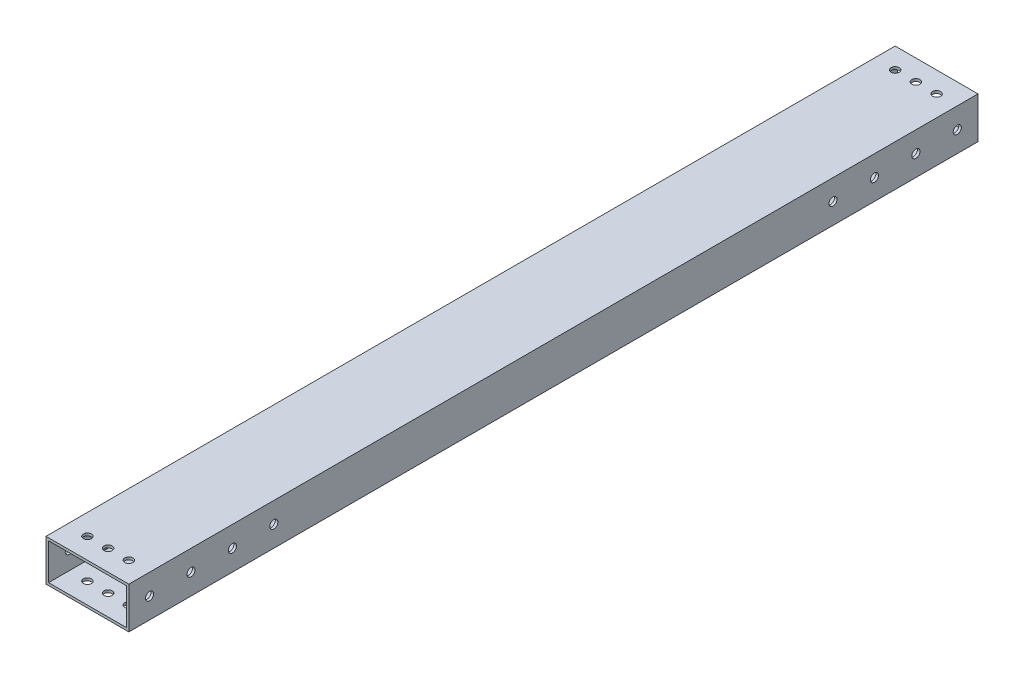
ISO-10303-21;
HEADER;
FILE_DESCRIPTION(('STEP AP214'),'2;1');
FILE_NAME('part.step','',(''),(''),'','','');
FILE_SCHEMA(('AUTOMOTIVE_DESIGN { 1 0 10303 214 1 1 1 1 }'));
ENDSEC;
DATA;
#1=APPLICATION_CONTEXT('core data for automotive mechanical design processes');
#2=APPLICATION_PROTOCOL_DEFINITION('international standard','automotive_design',2000,#1);
#3=PRODUCT_CONTEXT('',#1,'mechanical');
#4=PRODUCT('Part','Part','',(#3));
#5=PRODUCT_RELATED_PRODUCT_CATEGORY('part','',(#4));
#6=PRODUCT_DEFINITION_FORMATION('','',#4);
#7=PRODUCT_DEFINITION_CONTEXT('part definition',#1,'design');
#8=PRODUCT_DEFINITION('design','',#6,#7);
#9=PRODUCT_DEFINITION_SHAPE('','',#8);
#10=(LENGTH_UNIT() NAMED_UNIT(*) SI_UNIT(.MILLI.,.METRE.));
#11=(NAMED_UNIT(*) PLANE_ANGLE_UNIT() SI_UNIT($,.RADIAN.));
#12=(NAMED_UNIT(*) SI_UNIT($,.STERADIAN.) SOLID_ANGLE_UNIT());
#13=UNCERTAINTY_MEASURE_WITH_UNIT(LENGTH_MEASURE(1.E-05),#10,'distance_accuracy_value','');
#14=(GEOMETRIC_REPRESENTATION_CONTEXT(3) GLOBAL_UNCERTAINTY_ASSIGNED_CONTEXT((#13)) GLOBAL_UNIT_ASSIGNED_CONTEXT((#10,
#11,#12)) REPRESENTATION_CONTEXT('',''));
#15=CARTESIAN_POINT('',(0.,0.,0.));
#16=DIRECTION('',(0.,0.,1.));
#17=DIRECTION('',(1.,0.,0.));
#18=AXIS2_PLACEMENT_3D('',#15,#16,#17);
#19=CARTESIAN_POINT('',(0.,0.,260.35));
#20=DIRECTION('',(0.,0.,-1.));
#21=DIRECTION('',(-1.,0.,0.));
#22=AXIS2_PLACEMENT_3D('',#19,#20,#21);
#23=PLANE('',#22);
#24=DIRECTION('',(0.,1.,0.));
#25=VECTOR('',#24,1.);
#26=CARTESIAN_POINT('',(25.4,-12.7,260.35));
#27=LINE('',#26,#25);
#28=CARTESIAN_POINT('',(25.4,-12.7,260.35));
#29=VERTEX_POINT('',#28);
#30=CARTESIAN_POINT('',(25.4,12.7,260.35));
#31=VERTEX_POINT('',#30);
#32=EDGE_CURVE('E163',#29,#31,#27,.T.);
#33=ORIENTED_EDGE('',*,*,#32,.T.);
#34=DIRECTION('',(-1.,0.,0.));
#35=VECTOR('',#34,1.);
#36=CARTESIAN_POINT('',(-25.4,12.7,260.35));
#37=LINE('',#36,#35);
#38=CARTESIAN_POINT('',(-25.4,12.7,260.35));
#39=VERTEX_POINT('',#38);
#40=EDGE_CURVE('E167',#31,#39,#37,.T.);
#41=ORIENTED_EDGE('',*,*,#40,.T.);
#42=DIRECTION('',(0.,-1.,0.));
#43=VECTOR('',#42,1.);
#44=CARTESIAN_POINT('',(-25.4,-12.7,260.35));
#45=LINE('',#44,#43);
#46=CARTESIAN_POINT('',(-25.4,-12.7,260.35));
#47=VERTEX_POINT('',#46);
#48=EDGE_CURVE('E171',#39,#47,#45,.T.);
#49=ORIENTED_EDGE('',*,*,#48,.T.);
#50=DIRECTION('',(1.,0.,0.));
#51=VECTOR('',#50,1.);
#52=CARTESIAN_POINT('',(-25.4,-12.7,260.35));
#53=LINE('',#52,#51);
#54=EDGE_CURVE('E174',#47,#29,#53,.T.);
#55=ORIENTED_EDGE('',*,*,#54,.T.);
#56=EDGE_LOOP('',(#33,#41,#49,#55));
#57=FACE_BOUND('',#56,.T.);
#58=DIRECTION('',(0.,-1.,0.));
#59=VECTOR('',#58,1.);
#60=CARTESIAN_POINT('',(-23.8125,-11.1125,260.35));
#61=LINE('',#60,#59);
#62=CARTESIAN_POINT('',(-23.8125,11.1125,260.35));
#63=VERTEX_POINT('',#62);
#64=CARTESIAN_POINT('',(-23.8125,-11.1125,260.35));
#65=VERTEX_POINT('',#64);
#66=EDGE_CURVE('E113',#63,#65,#61,.T.);
#67=ORIENTED_EDGE('',*,*,#66,.F.);
#68=DIRECTION('',(-1.,0.,0.));
#69=VECTOR('',#68,1.);
#70=CARTESIAN_POINT('',(-23.8125,11.1125,260.35));
#71=LINE('',#70,#69);
#72=CARTESIAN_POINT('',(23.8125,11.1125,260.35));
#73=VERTEX_POINT('',#72);
#74=EDGE_CURVE('E139',#73,#63,#71,.T.);
#75=ORIENTED_EDGE('',*,*,#74,.F.);
#76=DIRECTION('',(0.,1.,0.));
#77=VECTOR('',#76,1.);
#78=CARTESIAN_POINT('',(23.8125,-11.1125,260.35));
#79=LINE('',#78,#77);
#80=CARTESIAN_POINT('',(23.8125,-11.1125,260.35));
#81=VERTEX_POINT('',#80);
#82=EDGE_CURVE('E135',#81,#73,#79,.T.);
#83=ORIENTED_EDGE('',*,*,#82,.F.);
#84=DIRECTION('',(1.,0.,0.));
#85=VECTOR('',#84,1.);
#86=CARTESIAN_POINT('',(-23.8125,-11.1125,260.35));
#87=LINE('',#86,#85);
#88=EDGE_CURVE('E122',#65,#81,#87,.T.);
#89=ORIENTED_EDGE('',*,*,#88,.F.);
#90=EDGE_LOOP('',(#67,#75,#83,#89));
#91=FACE_BOUND('',#90,.T.);
#92=ADVANCED_FACE('F45',(#57,#91),#23,.F.);
#93=CARTESIAN_POINT('',(0.,0.,-260.35));
#94=DIRECTION('',(0.,0.,-1.));
#95=DIRECTION('',(-1.,0.,0.));
#96=AXIS2_PLACEMENT_3D('',#93,#94,#95);
#97=PLANE('',#96);
#98=DIRECTION('',(0.,1.,0.));
#99=VECTOR('',#98,1.);
#100=CARTESIAN_POINT('',(25.4,-12.7,-260.35));
#101=LINE('',#100,#99);
#102=CARTESIAN_POINT('',(25.4,-12.7,-260.35));
#103=VERTEX_POINT('',#102);
#104=CARTESIAN_POINT('',(25.4,12.7,-260.35));
#105=VERTEX_POINT('',#104);
#106=EDGE_CURVE('E131',#103,#105,#101,.T.);
#107=ORIENTED_EDGE('',*,*,#106,.F.);
#108=DIRECTION('',(1.,0.,0.));
#109=VECTOR('',#108,1.);
#110=CARTESIAN_POINT('',(-25.4,-12.7,-260.35));
#111=LINE('',#110,#109);
#112=CARTESIAN_POINT('',(-25.4,-12.7,-260.35));
#113=VERTEX_POINT('',#112);
#114=EDGE_CURVE('E168',#113,#103,#111,.T.);
#115=ORIENTED_EDGE('',*,*,#114,.F.);
#116=DIRECTION('',(0.,-1.,0.));
#117=VECTOR('',#116,1.);
#118=CARTESIAN_POINT('',(-25.4,-12.7,-260.35));
#119=LINE('',#118,#117);
#120=CARTESIAN_POINT('',(-25.4,12.7,-260.35));
#121=VERTEX_POINT('',#120);
#122=EDGE_CURVE('E184',#121,#113,#119,.T.);
#123=ORIENTED_EDGE('',*,*,#122,.F.);
#124=DIRECTION('',(-1.,0.,0.));
#125=VECTOR('',#124,1.);
#126=CARTESIAN_POINT('',(-25.4,12.7,-260.35));
#127=LINE('',#126,#125);
#128=EDGE_CURVE('E181',#105,#121,#127,.T.);
#129=ORIENTED_EDGE('',*,*,#128,.F.);
#130=EDGE_LOOP('',(#107,#115,#123,#129));
#131=FACE_BOUND('',#130,.T.);
#132=DIRECTION('',(-1.,0.,0.));
#133=VECTOR('',#132,1.);
#134=CARTESIAN_POINT('',(-23.8125,11.1125,-260.35));
#135=LINE('',#134,#133);
#136=CARTESIAN_POINT('',(23.8125,11.1125,-260.35));
#137=VERTEX_POINT('',#136);
#138=CARTESIAN_POINT('',(-23.8125,11.1125,-260.35));
#139=VERTEX_POINT('',#138);
#140=EDGE_CURVE('E123',#137,#139,#135,.T.);
#141=ORIENTED_EDGE('',*,*,#140,.T.);
#142=DIRECTION('',(0.,-1.,0.));
#143=VECTOR('',#142,1.);
#144=CARTESIAN_POINT('',(-23.8125,-11.1125,-260.35));
#145=LINE('',#144,#143);
#146=CARTESIAN_POINT('',(-23.8125,-11.1125,-260.35));
#147=VERTEX_POINT('',#146);
#148=EDGE_CURVE('E71',#139,#147,#145,.T.);
#149=ORIENTED_EDGE('',*,*,#148,.T.);
#150=DIRECTION('',(1.,0.,0.));
#151=VECTOR('',#150,1.);
#152=CARTESIAN_POINT('',(-23.8125,-11.1125,-260.35));
#153=LINE('',#152,#151);
#154=CARTESIAN_POINT('',(23.8125,-11.1125,-260.35));
#155=VERTEX_POINT('',#154);
#156=EDGE_CURVE('E129',#147,#155,#153,.T.);
#157=ORIENTED_EDGE('',*,*,#156,.T.);
#158=DIRECTION('',(0.,1.,0.));
#159=VECTOR('',#158,1.);
#160=CARTESIAN_POINT('',(23.8125,-11.1125,-260.35));
#161=LINE('',#160,#159);
#162=EDGE_CURVE('E150',#155,#137,#161,.T.);
#163=ORIENTED_EDGE('',*,*,#162,.T.);
#164=EDGE_LOOP('',(#141,#149,#157,#163));
#165=FACE_BOUND('',#164,.T.);
#166=ADVANCED_FACE('F387',(#131,#165),#97,.T.);
#167=CARTESIAN_POINT('',(25.4,-12.7,260.35));
#168=DIRECTION('',(-1.,0.,0.));
#169=DIRECTION('',(0.,0.,1.));
#170=AXIS2_PLACEMENT_3D('',#167,#168,#169);
#171=PLANE('',#170);
#172=CARTESIAN_POINT('',(25.4,1.76247905159244E-12,-247.65));
#173=DIRECTION('',(1.,0.,0.));
#174=DIRECTION('',(0.,0.,-1.));
#175=AXIS2_PLACEMENT_3D('',#172,#173,#174);
#176=CIRCLE('',#175,2.48920000000001);
#177=CARTESIAN_POINT('',(25.4,1.76247905159244E-12,-250.1392));
#178=VERTEX_POINT('',#177);
#179=EDGE_CURVE('E500',#178,#178,#176,.T.);
#180=ORIENTED_EDGE('',*,*,#179,.F.);
#181=EDGE_LOOP('',(#180));
#182=FACE_BOUND('',#181,.T.);
#183=CARTESIAN_POINT('',(25.4,1.5306762493571E-12,222.25));
#184=DIRECTION('',(1.,0.,0.));
#185=DIRECTION('',(0.,0.,1.));
#186=AXIS2_PLACEMENT_3D('',#183,#184,#185);
#187=CIRCLE('',#186,2.4892);
#188=CARTESIAN_POINT('',(25.4,1.5306762493571E-12,224.7392));
#189=VERTEX_POINT('',#188);
#190=EDGE_CURVE('E524',#189,#189,#187,.T.);
#191=ORIENTED_EDGE('',*,*,#190,.F.);
#192=EDGE_LOOP('',(#191));
#193=FACE_BOUND('',#192,.T.);
#194=CARTESIAN_POINT('',(25.4,1.35953020308354E-12,196.85));
#195=DIRECTION('',(1.,0.,0.));
#196=DIRECTION('',(0.,0.,1.));
#197=AXIS2_PLACEMENT_3D('',#194,#195,#196);
#198=CIRCLE('',#197,2.4892);
#199=CARTESIAN_POINT('',(25.4,1.35953020308354E-12,199.3392));
#200=VERTEX_POINT('',#199);
#201=EDGE_CURVE('E516',#200,#200,#198,.T.);
#202=ORIENTED_EDGE('',*,*,#201,.F.);
#203=EDGE_LOOP('',(#202));
#204=FACE_BOUND('',#203,.T.);
#205=CARTESIAN_POINT('',(25.4,1.18838415680998E-12,171.45));
#206=DIRECTION('',(1.,0.,0.));
#207=DIRECTION('',(0.,0.,1.));
#208=AXIS2_PLACEMENT_3D('',#205,#206,#207);
#209=CIRCLE('',#208,2.4892);
#210=CARTESIAN_POINT('',(25.4,1.18838415680998E-12,173.9392));
#211=VERTEX_POINT('',#210);
#212=EDGE_CURVE('E507',#211,#211,#209,.T.);
#213=ORIENTED_EDGE('',*,*,#212,.F.);
#214=EDGE_LOOP('',(#213));
#215=FACE_BOUND('',#214,.T.);
#216=CARTESIAN_POINT('',(25.4,1.70182229563067E-12,247.65));
#217=DIRECTION('',(1.,0.,0.));
#218=DIRECTION('',(0.,0.,1.));
#219=AXIS2_PLACEMENT_3D('',#216,#217,#218);
#220=CIRCLE('',#219,2.4892);
#221=CARTESIAN_POINT('',(25.4,1.70182229563067E-12,250.1392));
#222=VERTEX_POINT('',#221);
#223=EDGE_CURVE('E504',#222,#222,#220,.T.);
#224=ORIENTED_EDGE('',*,*,#223,.F.);
#225=EDGE_LOOP('',(#224));
#226=FACE_BOUND('',#225,.T.);
#227=CARTESIAN_POINT('',(25.4,1.5851117995792E-12,-222.25));
#228=DIRECTION('',(1.,0.,0.));
#229=DIRECTION('',(0.,0.,-1.));
#230=AXIS2_PLACEMENT_3D('',#227,#228,#229);
#231=CIRCLE('',#230,2.4892);
#232=CARTESIAN_POINT('',(25.4,1.5851117995792E-12,-224.7392));
#233=VERTEX_POINT('',#232);
#234=EDGE_CURVE('E555',#233,#233,#231,.T.);
#235=ORIENTED_EDGE('',*,*,#234,.F.);
#236=EDGE_LOOP('',(#235));
#237=FACE_BOUND('',#236,.T.);
#238=CARTESIAN_POINT('',(25.4,1.40774454756597E-12,-196.85));
#239=DIRECTION('',(1.,0.,0.));
#240=DIRECTION('',(0.,0.,-1.));
#241=AXIS2_PLACEMENT_3D('',#238,#239,#240);
#242=CIRCLE('',#241,2.4892);
#243=CARTESIAN_POINT('',(25.4,1.40774454756597E-12,-199.3392));
#244=VERTEX_POINT('',#243);
#245=EDGE_CURVE('E532',#244,#244,#242,.T.);
#246=ORIENTED_EDGE('',*,*,#245,.F.);
#247=EDGE_LOOP('',(#246));
#248=FACE_BOUND('',#247,.T.);
#249=CARTESIAN_POINT('',(25.4,1.23037729555274E-12,-171.45));
#250=DIRECTION('',(1.,0.,0.));
#251=DIRECTION('',(0.,0.,-1.));
#252=AXIS2_PLACEMENT_3D('',#249,#250,#251);
#253=CIRCLE('',#252,2.4892);
#254=CARTESIAN_POINT('',(25.4,1.23037729555274E-12,-173.9392));
#255=VERTEX_POINT('',#254);
#256=EDGE_CURVE('E541',#255,#255,#253,.T.);
#257=ORIENTED_EDGE('',*,*,#256,.F.);
#258=EDGE_LOOP('',(#257));
#259=FACE_BOUND('',#258,.T.);
#260=ORIENTED_EDGE('',*,*,#106,.T.);
#261=DIRECTION('',(0.,0.,-1.));
#262=VECTOR('',#261,1.);
#263=CARTESIAN_POINT('',(25.4,12.7,260.35));
#264=LINE('',#263,#262);
#265=EDGE_CURVE('E11',#31,#105,#264,.T.);
#266=ORIENTED_EDGE('',*,*,#265,.F.);
#267=ORIENTED_EDGE('',*,*,#32,.F.);
#268=DIRECTION('',(0.,0.,-1.));
#269=VECTOR('',#268,1.);
#270=CARTESIAN_POINT('',(25.4,-12.7,260.35));
#271=LINE('',#270,#269);
#272=EDGE_CURVE('E177',#29,#103,#271,.T.);
#273=ORIENTED_EDGE('',*,*,#272,.T.);
#274=EDGE_LOOP('',(#260,#266,#267,#273));
#275=FACE_BOUND('',#274,.T.);
#276=ADVANCED_FACE('F47',(#182,#193,#204,#215,#226,#237,#248,#259,#275),#171,.F.);
#277=CARTESIAN_POINT('',(-25.4,12.7,260.35));
#278=DIRECTION('',(0.,-1.,0.));
#279=DIRECTION('',(0.,0.,-1.));
#280=AXIS2_PLACEMENT_3D('',#277,#278,#279);
#281=PLANE('',#280);
#282=CARTESIAN_POINT('',(-12.7,12.7,247.65));
#283=DIRECTION('',(0.,1.,0.));
#284=DIRECTION('',(0.,0.,-1.));
#285=AXIS2_PLACEMENT_3D('',#282,#283,#284);
#286=CIRCLE('',#285,2.48920000000002);
#287=CARTESIAN_POINT('',(-12.7,12.7,245.1608));
#288=VERTEX_POINT('',#287);
#289=EDGE_CURVE('E314',#288,#288,#286,.T.);
#290=ORIENTED_EDGE('',*,*,#289,.F.);
#291=EDGE_LOOP('',(#290));
#292=FACE_BOUND('',#291,.T.);
#293=CARTESIAN_POINT('',(0.,12.7,247.65));
#294=DIRECTION('',(0.,1.,0.));
#295=DIRECTION('',(0.,0.,-1.));
#296=AXIS2_PLACEMENT_3D('',#293,#294,#295);
#297=CIRCLE('',#296,2.48920000000002);
#298=CARTESIAN_POINT('',(0.,12.7,245.1608));
#299=VERTEX_POINT('',#298);
#300=EDGE_CURVE('E306',#299,#299,#297,.T.);
#301=ORIENTED_EDGE('',*,*,#300,.F.);
#302=EDGE_LOOP('',(#301));
#303=FACE_BOUND('',#302,.T.);
#304=CARTESIAN_POINT('',(12.7,12.7,247.65));
#305=DIRECTION('',(0.,1.,0.));
#306=DIRECTION('',(0.,0.,-1.));
#307=AXIS2_PLACEMENT_3D('',#304,#305,#306);
#308=CIRCLE('',#307,2.48920000000002);
#309=CARTESIAN_POINT('',(12.7,12.7,245.1608));
#310=VERTEX_POINT('',#309);
#311=EDGE_CURVE('E298',#310,#310,#308,.T.);
#312=ORIENTED_EDGE('',*,*,#311,.F.);
#313=EDGE_LOOP('',(#312));
#314=FACE_BOUND('',#313,.T.);
#315=CARTESIAN_POINT('',(12.7,12.7,-247.65));
#316=DIRECTION('',(0.,1.,0.));
#317=DIRECTION('',(0.,0.,1.));
#318=AXIS2_PLACEMENT_3D('',#315,#316,#317);
#319=CIRCLE('',#318,2.48920000000002);
#320=CARTESIAN_POINT('',(12.7,12.7,-245.1608));
#321=VERTEX_POINT('',#320);
#322=EDGE_CURVE('E290',#321,#321,#319,.T.);
#323=ORIENTED_EDGE('',*,*,#322,.F.);
#324=EDGE_LOOP('',(#323));
#325=FACE_BOUND('',#324,.T.);
#326=CARTESIAN_POINT('',(0.,12.7,-247.65));
#327=DIRECTION('',(0.,1.,0.));
#328=DIRECTION('',(0.,0.,1.));
#329=AXIS2_PLACEMENT_3D('',#326,#327,#328);
#330=CIRCLE('',#329,2.48920000000002);
#331=CARTESIAN_POINT('',(0.,12.7,-245.1608));
#332=VERTEX_POINT('',#331);
#333=EDGE_CURVE('E281',#332,#332,#330,.T.);
#334=ORIENTED_EDGE('',*,*,#333,.F.);
#335=EDGE_LOOP('',(#334));
#336=FACE_BOUND('',#335,.T.);
#337=CARTESIAN_POINT('',(-12.7,12.7,-247.65));
#338=DIRECTION('',(0.,1.,0.));
#339=DIRECTION('',(0.,0.,1.));
#340=AXIS2_PLACEMENT_3D('',#337,#338,#339);
#341=CIRCLE('',#340,2.48920000000002);
#342=CARTESIAN_POINT('',(-12.7,12.7,-245.1608));
#343=VERTEX_POINT('',#342);
#344=EDGE_CURVE('E285',#343,#343,#341,.T.);
#345=ORIENTED_EDGE('',*,*,#344,.F.);
#346=EDGE_LOOP('',(#345));
#347=FACE_BOUND('',#346,.T.);
#348=ORIENTED_EDGE('',*,*,#128,.T.);
#349=DIRECTION('',(0.,0.,-1.));
#350=VECTOR('',#349,1.);
#351=CARTESIAN_POINT('',(-25.4,12.7,260.35));
#352=LINE('',#351,#350);
#353=EDGE_CURVE('E55',#39,#121,#352,.T.);
#354=ORIENTED_EDGE('',*,*,#353,.F.);
#355=ORIENTED_EDGE('',*,*,#40,.F.);
#356=ORIENTED_EDGE('',*,*,#265,.T.);
#357=EDGE_LOOP('',(#348,#354,#355,#356));
#358=FACE_BOUND('',#357,.T.);
#359=ADVANCED_FACE('F391',(#292,#303,#314,#325,#336,#347,#358),#281,.F.);
#360=CARTESIAN_POINT('',(-25.4,-12.7,260.35));
#361=DIRECTION('',(1.,0.,0.));
#362=DIRECTION('',(0.,0.,-1.));
#363=AXIS2_PLACEMENT_3D('',#360,#361,#362);
#364=PLANE('',#363);
#365=CARTESIAN_POINT('',(-25.4,1.76247905159244E-12,-247.65));
#366=DIRECTION('',(1.,0.,0.));
#367=DIRECTION('',(0.,0.,-1.));
#368=AXIS2_PLACEMENT_3D('',#365,#366,#367);
#369=CIRCLE('',#368,2.48920000000001);
#370=CARTESIAN_POINT('',(-25.4,1.76247905159244E-12,-250.1392));
#371=VERTEX_POINT('',#370);
#372=EDGE_CURVE('E234',#371,#371,#369,.T.);
#373=ORIENTED_EDGE('',*,*,#372,.T.);
#374=EDGE_LOOP('',(#373));
#375=FACE_BOUND('',#374,.T.);
#376=CARTESIAN_POINT('',(-25.4,1.5306762493571E-12,222.25));
#377=DIRECTION('',(1.,0.,0.));
#378=DIRECTION('',(0.,0.,1.));
#379=AXIS2_PLACEMENT_3D('',#376,#377,#378);
#380=CIRCLE('',#379,2.4892);
#381=CARTESIAN_POINT('',(-25.4,1.5306762493571E-12,224.7392));
#382=VERTEX_POINT('',#381);
#383=EDGE_CURVE('E528',#382,#382,#380,.T.);
#384=ORIENTED_EDGE('',*,*,#383,.T.);
#385=EDGE_LOOP('',(#384));
#386=FACE_BOUND('',#385,.T.);
#387=CARTESIAN_POINT('',(-25.4,1.35953020308354E-12,196.85));
#388=DIRECTION('',(1.,0.,0.));
#389=DIRECTION('',(0.,0.,1.));
#390=AXIS2_PLACEMENT_3D('',#387,#388,#389);
#391=CIRCLE('',#390,2.4892);
#392=CARTESIAN_POINT('',(-25.4,1.35953020308354E-12,199.3392));
#393=VERTEX_POINT('',#392);
#394=EDGE_CURVE('E520',#393,#393,#391,.T.);
#395=ORIENTED_EDGE('',*,*,#394,.T.);
#396=EDGE_LOOP('',(#395));
#397=FACE_BOUND('',#396,.T.);
#398=CARTESIAN_POINT('',(-25.4,1.18838415680998E-12,171.45));
#399=DIRECTION('',(1.,0.,0.));
#400=DIRECTION('',(0.,0.,1.));
#401=AXIS2_PLACEMENT_3D('',#398,#399,#400);
#402=CIRCLE('',#401,2.4892);
#403=CARTESIAN_POINT('',(-25.4,1.18838415680998E-12,173.9392));
#404=VERTEX_POINT('',#403);
#405=EDGE_CURVE('E512',#404,#404,#402,.T.);
#406=ORIENTED_EDGE('',*,*,#405,.T.);
#407=EDGE_LOOP('',(#406));
#408=FACE_BOUND('',#407,.T.);
#409=CARTESIAN_POINT('',(-25.4,1.70182229563067E-12,247.65));
#410=DIRECTION('',(1.,0.,0.));
#411=DIRECTION('',(0.,0.,1.));
#412=AXIS2_PLACEMENT_3D('',#409,#410,#411);
#413=CIRCLE('',#412,2.4892);
#414=CARTESIAN_POINT('',(-25.4,1.70182229563067E-12,250.1392));
#415=VERTEX_POINT('',#414);
#416=EDGE_CURVE('E551',#415,#415,#413,.T.);
#417=ORIENTED_EDGE('',*,*,#416,.T.);
#418=EDGE_LOOP('',(#417));
#419=FACE_BOUND('',#418,.T.);
#420=CARTESIAN_POINT('',(-25.4,1.5851117995792E-12,-222.25));
#421=DIRECTION('',(1.,0.,0.));
#422=DIRECTION('',(0.,0.,-1.));
#423=AXIS2_PLACEMENT_3D('',#420,#421,#422);
#424=CIRCLE('',#423,2.4892);
#425=CARTESIAN_POINT('',(-25.4,1.5851117995792E-12,-224.7392));
#426=VERTEX_POINT('',#425);
#427=EDGE_CURVE('E536',#426,#426,#424,.T.);
#428=ORIENTED_EDGE('',*,*,#427,.T.);
#429=EDGE_LOOP('',(#428));
#430=FACE_BOUND('',#429,.T.);
#431=CARTESIAN_POINT('',(-25.4,1.40774454756597E-12,-196.85));
#432=DIRECTION('',(1.,0.,0.));
#433=DIRECTION('',(0.,0.,-1.));
#434=AXIS2_PLACEMENT_3D('',#431,#432,#433);
#435=CIRCLE('',#434,2.4892);
#436=CARTESIAN_POINT('',(-25.4,1.40774454756597E-12,-199.3392));
#437=VERTEX_POINT('',#436);
#438=EDGE_CURVE('E537',#437,#437,#435,.T.);
#439=ORIENTED_EDGE('',*,*,#438,.T.);
#440=EDGE_LOOP('',(#439));
#441=FACE_BOUND('',#440,.T.);
#442=CARTESIAN_POINT('',(-25.4,1.23037729555274E-12,-171.45));
#443=DIRECTION('',(1.,0.,0.));
#444=DIRECTION('',(0.,0.,-1.));
#445=AXIS2_PLACEMENT_3D('',#442,#443,#444);
#446=CIRCLE('',#445,2.4892);
#447=CARTESIAN_POINT('',(-25.4,1.23037729555274E-12,-173.9392));
#448=VERTEX_POINT('',#447);
#449=EDGE_CURVE('E511',#448,#448,#446,.T.);
#450=ORIENTED_EDGE('',*,*,#449,.T.);
#451=EDGE_LOOP('',(#450));
#452=FACE_BOUND('',#451,.T.);
#453=ORIENTED_EDGE('',*,*,#122,.T.);
#454=DIRECTION('',(0.,0.,-1.));
#455=VECTOR('',#454,1.);
#456=CARTESIAN_POINT('',(-25.4,-12.7,260.35));
#457=LINE('',#456,#455);
#458=EDGE_CURVE('E192',#47,#113,#457,.T.);
#459=ORIENTED_EDGE('',*,*,#458,.F.);
#460=ORIENTED_EDGE('',*,*,#48,.F.);
#461=ORIENTED_EDGE('',*,*,#353,.T.);
#462=EDGE_LOOP('',(#453,#459,#460,#461));
#463=FACE_BOUND('',#462,.T.);
#464=ADVANCED_FACE('F374',(#375,#386,#397,#408,#419,#430,#441,#452,#463),#364,.F.);
#465=CARTESIAN_POINT('',(-25.4,-12.7,260.35));
#466=DIRECTION('',(0.,1.,0.));
#467=DIRECTION('',(0.,0.,1.));
#468=AXIS2_PLACEMENT_3D('',#465,#466,#467);
#469=PLANE('',#468);
#470=CARTESIAN_POINT('',(-12.7,-12.7,247.65));
#471=DIRECTION('',(0.,1.,0.));
#472=DIRECTION('',(0.,0.,-1.));
#473=AXIS2_PLACEMENT_3D('',#470,#471,#472);
#474=CIRCLE('',#473,2.48920000000002);
#475=CARTESIAN_POINT('',(-12.7,-12.7,245.1608));
#476=VERTEX_POINT('',#475);
#477=EDGE_CURVE('E280',#476,#476,#474,.T.);
#478=ORIENTED_EDGE('',*,*,#477,.T.);
#479=EDGE_LOOP('',(#478));
#480=FACE_BOUND('',#479,.T.);
#481=CARTESIAN_POINT('',(0.,-12.7,247.65));
#482=DIRECTION('',(0.,1.,0.));
#483=DIRECTION('',(0.,0.,-1.));
#484=AXIS2_PLACEMENT_3D('',#481,#482,#483);
#485=CIRCLE('',#484,2.48920000000002);
#486=CARTESIAN_POINT('',(0.,-12.7,245.1608));
#487=VERTEX_POINT('',#486);
#488=EDGE_CURVE('E310',#487,#487,#485,.T.);
#489=ORIENTED_EDGE('',*,*,#488,.T.);
#490=EDGE_LOOP('',(#489));
#491=FACE_BOUND('',#490,.T.);
#492=CARTESIAN_POINT('',(12.7,-12.7,247.65));
#493=DIRECTION('',(0.,1.,0.));
#494=DIRECTION('',(0.,0.,-1.));
#495=AXIS2_PLACEMENT_3D('',#492,#493,#494);
#496=CIRCLE('',#495,2.48920000000002);
#497=CARTESIAN_POINT('',(12.7,-12.7,245.1608));
#498=VERTEX_POINT('',#497);
#499=EDGE_CURVE('E302',#498,#498,#496,.T.);
#500=ORIENTED_EDGE('',*,*,#499,.T.);
#501=EDGE_LOOP('',(#500));
#502=FACE_BOUND('',#501,.T.);
#503=CARTESIAN_POINT('',(12.7,-12.7,-247.65));
#504=DIRECTION('',(0.,1.,0.));
#505=DIRECTION('',(0.,0.,1.));
#506=AXIS2_PLACEMENT_3D('',#503,#504,#505);
#507=CIRCLE('',#506,2.48920000000002);
#508=CARTESIAN_POINT('',(12.7,-12.7,-245.1608));
#509=VERTEX_POINT('',#508);
#510=EDGE_CURVE('E294',#509,#509,#507,.T.);
#511=ORIENTED_EDGE('',*,*,#510,.T.);
#512=EDGE_LOOP('',(#511));
#513=FACE_BOUND('',#512,.T.);
#514=CARTESIAN_POINT('',(0.,-12.7,-247.65));
#515=DIRECTION('',(0.,1.,0.));
#516=DIRECTION('',(0.,0.,1.));
#517=AXIS2_PLACEMENT_3D('',#514,#515,#516);
#518=CIRCLE('',#517,2.48920000000002);
#519=CARTESIAN_POINT('',(0.,-12.7,-245.1608));
#520=VERTEX_POINT('',#519);
#521=EDGE_CURVE('E286',#520,#520,#518,.T.);
#522=ORIENTED_EDGE('',*,*,#521,.T.);
#523=EDGE_LOOP('',(#522));
#524=FACE_BOUND('',#523,.T.);
#525=CARTESIAN_POINT('',(-12.7,-12.7,-247.65));
#526=DIRECTION('',(0.,1.,0.));
#527=DIRECTION('',(0.,0.,1.));
#528=AXIS2_PLACEMENT_3D('',#525,#526,#527);
#529=CIRCLE('',#528,2.48920000000002);
#530=CARTESIAN_POINT('',(-12.7,-12.7,-245.1608));
#531=VERTEX_POINT('',#530);
#532=EDGE_CURVE('E204',#531,#531,#529,.T.);
#533=ORIENTED_EDGE('',*,*,#532,.T.);
#534=EDGE_LOOP('',(#533));
#535=FACE_BOUND('',#534,.T.);
#536=ORIENTED_EDGE('',*,*,#114,.T.);
#537=ORIENTED_EDGE('',*,*,#272,.F.);
#538=ORIENTED_EDGE('',*,*,#54,.F.);
#539=ORIENTED_EDGE('',*,*,#458,.T.);
#540=EDGE_LOOP('',(#536,#537,#538,#539));
#541=FACE_BOUND('',#540,.T.);
#542=ADVANCED_FACE('F371',(#480,#491,#502,#513,#524,#535,#541),#469,.F.);
#543=CARTESIAN_POINT('',(-23.8125,-11.1125,260.35));
#544=DIRECTION('',(1.,0.,0.));
#545=DIRECTION('',(0.,0.,-1.));
#546=AXIS2_PLACEMENT_3D('',#543,#544,#545);
#547=PLANE('',#546);
#548=CARTESIAN_POINT('',(-23.8125,1.76247905159244E-12,-247.65));
#549=DIRECTION('',(1.,0.,0.));
#550=DIRECTION('',(0.,0.,-1.));
#551=AXIS2_PLACEMENT_3D('',#548,#549,#550);
#552=CIRCLE('',#551,2.48920000000001);
#553=CARTESIAN_POINT('',(-23.8125,1.76247905159244E-12,-250.1392));
#554=VERTEX_POINT('',#553);
#555=EDGE_CURVE('E276',#554,#554,#552,.T.);
#556=ORIENTED_EDGE('',*,*,#555,.F.);
#557=EDGE_LOOP('',(#556));
#558=FACE_BOUND('',#557,.T.);
#559=CARTESIAN_POINT('',(-23.8125,1.5306762493571E-12,222.25));
#560=DIRECTION('',(1.,0.,0.));
#561=DIRECTION('',(0.,0.,-1.));
#562=AXIS2_PLACEMENT_3D('',#559,#560,#561);
#563=CIRCLE('',#562,2.4892);
#564=CARTESIAN_POINT('',(-23.8125,1.5306762493571E-12,219.7608));
#565=VERTEX_POINT('',#564);
#566=EDGE_CURVE('E262',#565,#565,#563,.T.);
#567=ORIENTED_EDGE('',*,*,#566,.F.);
#568=EDGE_LOOP('',(#567));
#569=FACE_BOUND('',#568,.T.);
#570=CARTESIAN_POINT('',(-23.8125,1.35953020308354E-12,196.85));
#571=DIRECTION('',(1.,0.,0.));
#572=DIRECTION('',(0.,0.,-1.));
#573=AXIS2_PLACEMENT_3D('',#570,#571,#572);
#574=CIRCLE('',#573,2.4892);
#575=CARTESIAN_POINT('',(-23.8125,1.35953020308354E-12,194.3608));
#576=VERTEX_POINT('',#575);
#577=EDGE_CURVE('E258',#576,#576,#574,.T.);
#578=ORIENTED_EDGE('',*,*,#577,.F.);
#579=EDGE_LOOP('',(#578));
#580=FACE_BOUND('',#579,.T.);
#581=CARTESIAN_POINT('',(-23.8125,1.18838415680998E-12,171.45));
#582=DIRECTION('',(1.,0.,0.));
#583=DIRECTION('',(0.,0.,-1.));
#584=AXIS2_PLACEMENT_3D('',#581,#582,#583);
#585=CIRCLE('',#584,2.4892);
#586=CARTESIAN_POINT('',(-23.8125,1.18838415680998E-12,168.9608));
#587=VERTEX_POINT('',#586);
#588=EDGE_CURVE('E254',#587,#587,#585,.T.);
#589=ORIENTED_EDGE('',*,*,#588,.F.);
#590=EDGE_LOOP('',(#589));
#591=FACE_BOUND('',#590,.T.);
#592=CARTESIAN_POINT('',(-23.8125,1.70182229563067E-12,247.65));
#593=DIRECTION('',(1.,0.,0.));
#594=DIRECTION('',(0.,0.,-1.));
#595=AXIS2_PLACEMENT_3D('',#592,#593,#594);
#596=CIRCLE('',#595,2.4892);
#597=CARTESIAN_POINT('',(-23.8125,1.70182229563067E-12,245.1608));
#598=VERTEX_POINT('',#597);
#599=EDGE_CURVE('E249',#598,#598,#596,.T.);
#600=ORIENTED_EDGE('',*,*,#599,.F.);
#601=EDGE_LOOP('',(#600));
#602=FACE_BOUND('',#601,.T.);
#603=CARTESIAN_POINT('',(-23.8125,1.5851117995792E-12,-222.25));
#604=DIRECTION('',(1.,0.,0.));
#605=DIRECTION('',(0.,0.,-1.));
#606=AXIS2_PLACEMENT_3D('',#603,#604,#605);
#607=CIRCLE('',#606,2.4892);
#608=CARTESIAN_POINT('',(-23.8125,1.5851117995792E-12,-224.7392));
#609=VERTEX_POINT('',#608);
#610=EDGE_CURVE('E244',#609,#609,#607,.T.);
#611=ORIENTED_EDGE('',*,*,#610,.F.);
#612=EDGE_LOOP('',(#611));
#613=FACE_BOUND('',#612,.T.);
#614=CARTESIAN_POINT('',(-23.8125,1.40774454756597E-12,-196.85));
#615=DIRECTION('',(1.,0.,0.));
#616=DIRECTION('',(0.,0.,-1.));
#617=AXIS2_PLACEMENT_3D('',#614,#615,#616);
#618=CIRCLE('',#617,2.4892);
#619=CARTESIAN_POINT('',(-23.8125,1.40774454756597E-12,-199.3392));
#620=VERTEX_POINT('',#619);
#621=EDGE_CURVE('E239',#620,#620,#618,.T.);
#622=ORIENTED_EDGE('',*,*,#621,.F.);
#623=EDGE_LOOP('',(#622));
#624=FACE_BOUND('',#623,.T.);
#625=CARTESIAN_POINT('',(-23.8125,1.23037729555274E-12,-171.45));
#626=DIRECTION('',(1.,0.,0.));
#627=DIRECTION('',(0.,0.,-1.));
#628=AXIS2_PLACEMENT_3D('',#625,#626,#627);
#629=CIRCLE('',#628,2.4892);
#630=CARTESIAN_POINT('',(-23.8125,1.23037729555274E-12,-173.9392));
#631=VERTEX_POINT('',#630);
#632=EDGE_CURVE('E233',#631,#631,#629,.T.);
#633=ORIENTED_EDGE('',*,*,#632,.F.);
#634=EDGE_LOOP('',(#633));
#635=FACE_BOUND('',#634,.T.);
#636=ORIENTED_EDGE('',*,*,#148,.F.);
#637=DIRECTION('',(0.,0.,-1.));
#638=VECTOR('',#637,1.);
#639=CARTESIAN_POINT('',(-23.8125,11.1125,260.35));
#640=LINE('',#639,#638);
#641=EDGE_CURVE('E117',#63,#139,#640,.T.);
#642=ORIENTED_EDGE('',*,*,#641,.F.);
#643=ORIENTED_EDGE('',*,*,#66,.T.);
#644=DIRECTION('',(0.,0.,-1.));
#645=VECTOR('',#644,1.);
#646=CARTESIAN_POINT('',(-23.8125,-11.1125,260.35));
#647=LINE('',#646,#645);
#648=EDGE_CURVE('E116',#65,#147,#647,.T.);
#649=ORIENTED_EDGE('',*,*,#648,.T.);
#650=EDGE_LOOP('',(#636,#642,#643,#649));
#651=FACE_BOUND('',#650,.T.);
#652=ADVANCED_FACE('F115',(#558,#569,#580,#591,#602,#613,#624,#635,#651),#547,.T.);
#653=CARTESIAN_POINT('',(-23.8125,-11.1125,260.35));
#654=DIRECTION('',(0.,1.,0.));
#655=DIRECTION('',(0.,0.,1.));
#656=AXIS2_PLACEMENT_3D('',#653,#654,#655);
#657=PLANE('',#656);
#658=CARTESIAN_POINT('',(-12.7,-11.1125,247.65));
#659=DIRECTION('',(0.,1.,0.));
#660=DIRECTION('',(0.,0.,1.));
#661=AXIS2_PLACEMENT_3D('',#658,#659,#660);
#662=CIRCLE('',#661,2.48920000000002);
#663=CARTESIAN_POINT('',(-12.7,-11.1125,250.1392));
#664=VERTEX_POINT('',#663);
#665=EDGE_CURVE('E147',#664,#664,#662,.T.);
#666=ORIENTED_EDGE('',*,*,#665,.F.);
#667=EDGE_LOOP('',(#666));
#668=FACE_BOUND('',#667,.T.);
#669=CARTESIAN_POINT('',(0.,-11.1125,247.65));
#670=DIRECTION('',(0.,1.,0.));
#671=DIRECTION('',(0.,0.,1.));
#672=AXIS2_PLACEMENT_3D('',#669,#670,#671);
#673=CIRCLE('',#672,2.48920000000002);
#674=CARTESIAN_POINT('',(0.,-11.1125,250.1392));
#675=VERTEX_POINT('',#674);
#676=EDGE_CURVE('E224',#675,#675,#673,.T.);
#677=ORIENTED_EDGE('',*,*,#676,.F.);
#678=EDGE_LOOP('',(#677));
#679=FACE_BOUND('',#678,.T.);
#680=CARTESIAN_POINT('',(12.7,-11.1125,247.65));
#681=DIRECTION('',(0.,1.,0.));
#682=DIRECTION('',(0.,0.,1.));
#683=AXIS2_PLACEMENT_3D('',#680,#681,#682);
#684=CIRCLE('',#683,2.48920000000002);
#685=CARTESIAN_POINT('',(12.7,-11.1125,250.1392));
#686=VERTEX_POINT('',#685);
#687=EDGE_CURVE('E219',#686,#686,#684,.T.);
#688=ORIENTED_EDGE('',*,*,#687,.F.);
#689=EDGE_LOOP('',(#688));
#690=FACE_BOUND('',#689,.T.);
#691=CARTESIAN_POINT('',(12.7,-11.1125,-247.65));
#692=DIRECTION('',(0.,1.,0.));
#693=DIRECTION('',(0.,0.,1.));
#694=AXIS2_PLACEMENT_3D('',#691,#692,#693);
#695=CIRCLE('',#694,2.48920000000002);
#696=CARTESIAN_POINT('',(12.7,-11.1125,-245.1608));
#697=VERTEX_POINT('',#696);
#698=EDGE_CURVE('E214',#697,#697,#695,.T.);
#699=ORIENTED_EDGE('',*,*,#698,.F.);
#700=EDGE_LOOP('',(#699));
#701=FACE_BOUND('',#700,.T.);
#702=CARTESIAN_POINT('',(0.,-11.1125,-247.65));
#703=DIRECTION('',(0.,1.,0.));
#704=DIRECTION('',(0.,0.,1.));
#705=AXIS2_PLACEMENT_3D('',#702,#703,#704);
#706=CIRCLE('',#705,2.48920000000002);
#707=CARTESIAN_POINT('',(0.,-11.1125,-245.1608));
#708=VERTEX_POINT('',#707);
#709=EDGE_CURVE('E209',#708,#708,#706,.T.);
#710=ORIENTED_EDGE('',*,*,#709,.F.);
#711=EDGE_LOOP('',(#710));
#712=FACE_BOUND('',#711,.T.);
#713=CARTESIAN_POINT('',(-12.7,-11.1125,-247.65));
#714=DIRECTION('',(0.,1.,0.));
#715=DIRECTION('',(0.,0.,1.));
#716=AXIS2_PLACEMENT_3D('',#713,#714,#715);
#717=CIRCLE('',#716,2.48920000000002);
#718=CARTESIAN_POINT('',(-12.7,-11.1125,-245.1608));
#719=VERTEX_POINT('',#718);
#720=EDGE_CURVE('E203',#719,#719,#717,.T.);
#721=ORIENTED_EDGE('',*,*,#720,.F.);
#722=EDGE_LOOP('',(#721));
#723=FACE_BOUND('',#722,.T.);
#724=ORIENTED_EDGE('',*,*,#156,.F.);
#725=ORIENTED_EDGE('',*,*,#648,.F.);
#726=ORIENTED_EDGE('',*,*,#88,.T.);
#727=DIRECTION('',(0.,0.,-1.));
#728=VECTOR('',#727,1.);
#729=CARTESIAN_POINT('',(23.8125,-11.1125,260.35));
#730=LINE('',#729,#728);
#731=EDGE_CURVE('E132',#81,#155,#730,.T.);
#732=ORIENTED_EDGE('',*,*,#731,.T.);
#733=EDGE_LOOP('',(#724,#725,#726,#732));
#734=FACE_BOUND('',#733,.T.);
#735=ADVANCED_FACE('F126',(#668,#679,#690,#701,#712,#723,#734),#657,.T.);
#736=CARTESIAN_POINT('',(23.8125,-11.1125,260.35));
#737=DIRECTION('',(-1.,0.,0.));
#738=DIRECTION('',(0.,0.,1.));
#739=AXIS2_PLACEMENT_3D('',#736,#737,#738);
#740=PLANE('',#739);
#741=CARTESIAN_POINT('',(23.8125,1.76247905159244E-12,-247.65));
#742=DIRECTION('',(-1.,0.,0.));
#743=DIRECTION('',(0.,0.,1.));
#744=AXIS2_PLACEMENT_3D('',#741,#742,#743);
#745=CIRCLE('',#744,2.48920000000001);
#746=CARTESIAN_POINT('',(23.8125,1.76247905159244E-12,-245.1608));
#747=VERTEX_POINT('',#746);
#748=EDGE_CURVE('E49',#747,#747,#745,.T.);
#749=ORIENTED_EDGE('',*,*,#748,.F.);
#750=EDGE_LOOP('',(#749));
#751=FACE_BOUND('',#750,.T.);
#752=CARTESIAN_POINT('',(23.8125,1.5306762493571E-12,222.25));
#753=DIRECTION('',(-1.,0.,0.));
#754=DIRECTION('',(0.,0.,1.));
#755=AXIS2_PLACEMENT_3D('',#752,#753,#754);
#756=CIRCLE('',#755,2.4892);
#757=CARTESIAN_POINT('',(23.8125,1.5306762493571E-12,224.7392));
#758=VERTEX_POINT('',#757);
#759=EDGE_CURVE('E259',#758,#758,#756,.T.);
#760=ORIENTED_EDGE('',*,*,#759,.F.);
#761=EDGE_LOOP('',(#760));
#762=FACE_BOUND('',#761,.T.);
#763=CARTESIAN_POINT('',(23.8125,1.35953020308354E-12,196.85));
#764=DIRECTION('',(-1.,0.,0.));
#765=DIRECTION('',(0.,0.,1.));
#766=AXIS2_PLACEMENT_3D('',#763,#764,#765);
#767=CIRCLE('',#766,2.4892);
#768=CARTESIAN_POINT('',(23.8125,1.35953020308354E-12,199.3392));
#769=VERTEX_POINT('',#768);
#770=EDGE_CURVE('E255',#769,#769,#767,.T.);
#771=ORIENTED_EDGE('',*,*,#770,.F.);
#772=EDGE_LOOP('',(#771));
#773=FACE_BOUND('',#772,.T.);
#774=CARTESIAN_POINT('',(23.8125,1.18838415680998E-12,171.45));
#775=DIRECTION('',(-1.,0.,0.));
#776=DIRECTION('',(0.,0.,1.));
#777=AXIS2_PLACEMENT_3D('',#774,#775,#776);
#778=CIRCLE('',#777,2.4892);
#779=CARTESIAN_POINT('',(23.8125,1.18838415680998E-12,173.9392));
#780=VERTEX_POINT('',#779);
#781=EDGE_CURVE('E250',#780,#780,#778,.T.);
#782=ORIENTED_EDGE('',*,*,#781,.F.);
#783=EDGE_LOOP('',(#782));
#784=FACE_BOUND('',#783,.T.);
#785=CARTESIAN_POINT('',(23.8125,1.70182229563067E-12,247.65));
#786=DIRECTION('',(-1.,0.,0.));
#787=DIRECTION('',(0.,0.,1.));
#788=AXIS2_PLACEMENT_3D('',#785,#786,#787);
#789=CIRCLE('',#788,2.4892);
#790=CARTESIAN_POINT('',(23.8125,1.70182229563067E-12,250.1392));
#791=VERTEX_POINT('',#790);
#792=EDGE_CURVE('E245',#791,#791,#789,.T.);
#793=ORIENTED_EDGE('',*,*,#792,.F.);
#794=EDGE_LOOP('',(#793));
#795=FACE_BOUND('',#794,.T.);
#796=CARTESIAN_POINT('',(23.8125,1.5851117995792E-12,-222.25));
#797=DIRECTION('',(-1.,0.,0.));
#798=DIRECTION('',(0.,0.,1.));
#799=AXIS2_PLACEMENT_3D('',#796,#797,#798);
#800=CIRCLE('',#799,2.4892);
#801=CARTESIAN_POINT('',(23.8125,1.5851117995792E-12,-219.7608));
#802=VERTEX_POINT('',#801);
#803=EDGE_CURVE('E240',#802,#802,#800,.T.);
#804=ORIENTED_EDGE('',*,*,#803,.F.);
#805=EDGE_LOOP('',(#804));
#806=FACE_BOUND('',#805,.T.);
#807=CARTESIAN_POINT('',(23.8125,1.40774454756597E-12,-196.85));
#808=DIRECTION('',(-1.,0.,0.));
#809=DIRECTION('',(0.,0.,1.));
#810=AXIS2_PLACEMENT_3D('',#807,#808,#809);
#811=CIRCLE('',#810,2.4892);
#812=CARTESIAN_POINT('',(23.8125,1.40774454756597E-12,-194.3608));
#813=VERTEX_POINT('',#812);
#814=EDGE_CURVE('E235',#813,#813,#811,.T.);
#815=ORIENTED_EDGE('',*,*,#814,.F.);
#816=EDGE_LOOP('',(#815));
#817=FACE_BOUND('',#816,.T.);
#818=CARTESIAN_POINT('',(23.8125,1.23037729555274E-12,-171.45));
#819=DIRECTION('',(-1.,0.,0.));
#820=DIRECTION('',(0.,0.,1.));
#821=AXIS2_PLACEMENT_3D('',#818,#819,#820);
#822=CIRCLE('',#821,2.4892);
#823=CARTESIAN_POINT('',(23.8125,1.23037729555274E-12,-168.9608));
#824=VERTEX_POINT('',#823);
#825=EDGE_CURVE('E229',#824,#824,#822,.T.);
#826=ORIENTED_EDGE('',*,*,#825,.F.);
#827=EDGE_LOOP('',(#826));
#828=FACE_BOUND('',#827,.T.);
#829=ORIENTED_EDGE('',*,*,#162,.F.);
#830=ORIENTED_EDGE('',*,*,#731,.F.);
#831=ORIENTED_EDGE('',*,*,#82,.T.);
#832=DIRECTION('',(0.,0.,-1.));
#833=VECTOR('',#832,1.);
#834=CARTESIAN_POINT('',(23.8125,11.1125,260.35));
#835=LINE('',#834,#833);
#836=EDGE_CURVE('E63',#73,#137,#835,.T.);
#837=ORIENTED_EDGE('',*,*,#836,.T.);
#838=EDGE_LOOP('',(#829,#830,#831,#837));
#839=FACE_BOUND('',#838,.T.);
#840=ADVANCED_FACE('F350',(#751,#762,#773,#784,#795,#806,#817,#828,#839),#740,.T.);
#841=CARTESIAN_POINT('',(-23.8125,11.1125,260.35));
#842=DIRECTION('',(0.,-1.,0.));
#843=DIRECTION('',(1.,0.,0.));
#844=AXIS2_PLACEMENT_3D('',#841,#842,#843);
#845=PLANE('',#844);
#846=CARTESIAN_POINT('',(-12.7,11.1125,247.65));
#847=DIRECTION('',(0.,-1.,0.));
#848=DIRECTION('',(1.,0.,0.));
#849=AXIS2_PLACEMENT_3D('',#846,#847,#848);
#850=CIRCLE('',#849,2.48920000000002);
#851=CARTESIAN_POINT('',(-10.2108,11.1125,247.65));
#852=VERTEX_POINT('',#851);
#853=EDGE_CURVE('E225',#852,#852,#850,.T.);
#854=ORIENTED_EDGE('',*,*,#853,.F.);
#855=EDGE_LOOP('',(#854));
#856=FACE_BOUND('',#855,.T.);
#857=CARTESIAN_POINT('',(0.,11.1125,247.65));
#858=DIRECTION('',(0.,-1.,0.));
#859=DIRECTION('',(1.,0.,0.));
#860=AXIS2_PLACEMENT_3D('',#857,#858,#859);
#861=CIRCLE('',#860,2.48920000000002);
#862=CARTESIAN_POINT('',(2.48920000000002,11.1125,247.65));
#863=VERTEX_POINT('',#862);
#864=EDGE_CURVE('E220',#863,#863,#861,.T.);
#865=ORIENTED_EDGE('',*,*,#864,.F.);
#866=EDGE_LOOP('',(#865));
#867=FACE_BOUND('',#866,.T.);
#868=CARTESIAN_POINT('',(12.7,11.1125,247.65));
#869=DIRECTION('',(0.,-1.,0.));
#870=DIRECTION('',(1.,0.,0.));
#871=AXIS2_PLACEMENT_3D('',#868,#869,#870);
#872=CIRCLE('',#871,2.48920000000002);
#873=CARTESIAN_POINT('',(15.1892,11.1125,247.65));
#874=VERTEX_POINT('',#873);
#875=EDGE_CURVE('E215',#874,#874,#872,.T.);
#876=ORIENTED_EDGE('',*,*,#875,.F.);
#877=EDGE_LOOP('',(#876));
#878=FACE_BOUND('',#877,.T.);
#879=CARTESIAN_POINT('',(12.7,11.1125,-247.65));
#880=DIRECTION('',(0.,-1.,0.));
#881=DIRECTION('',(1.,0.,0.));
#882=AXIS2_PLACEMENT_3D('',#879,#880,#881);
#883=CIRCLE('',#882,2.48920000000002);
#884=CARTESIAN_POINT('',(15.1892,11.1125,-247.65));
#885=VERTEX_POINT('',#884);
#886=EDGE_CURVE('E210',#885,#885,#883,.T.);
#887=ORIENTED_EDGE('',*,*,#886,.F.);
#888=EDGE_LOOP('',(#887));
#889=FACE_BOUND('',#888,.T.);
#890=CARTESIAN_POINT('',(0.,11.1125,-247.65));
#891=DIRECTION('',(0.,-1.,0.));
#892=DIRECTION('',(1.,0.,0.));
#893=AXIS2_PLACEMENT_3D('',#890,#891,#892);
#894=CIRCLE('',#893,2.48920000000002);
#895=CARTESIAN_POINT('',(2.48920000000002,11.1125,-247.65));
#896=VERTEX_POINT('',#895);
#897=EDGE_CURVE('E205',#896,#896,#894,.T.);
#898=ORIENTED_EDGE('',*,*,#897,.F.);
#899=EDGE_LOOP('',(#898));
#900=FACE_BOUND('',#899,.T.);
#901=CARTESIAN_POINT('',(-12.7,11.1125,-247.65));
#902=DIRECTION('',(0.,-1.,0.));
#903=DIRECTION('',(1.,0.,0.));
#904=AXIS2_PLACEMENT_3D('',#901,#902,#903);
#905=CIRCLE('',#904,2.48920000000002);
#906=CARTESIAN_POINT('',(-10.2108,11.1125,-247.65));
#907=VERTEX_POINT('',#906);
#908=EDGE_CURVE('E199',#907,#907,#905,.T.);
#909=ORIENTED_EDGE('',*,*,#908,.F.);
#910=EDGE_LOOP('',(#909));
#911=FACE_BOUND('',#910,.T.);
#912=ORIENTED_EDGE('',*,*,#140,.F.);
#913=ORIENTED_EDGE('',*,*,#836,.F.);
#914=ORIENTED_EDGE('',*,*,#74,.T.);
#915=ORIENTED_EDGE('',*,*,#641,.T.);
#916=EDGE_LOOP('',(#912,#913,#914,#915));
#917=FACE_BOUND('',#916,.T.);
#918=ADVANCED_FACE('F417',(#856,#867,#878,#889,#900,#911,#917),#845,.T.);
#919=CARTESIAN_POINT('',(-12.7,-12.7,-247.65));
#920=DIRECTION('',(0.,1.,0.));
#921=DIRECTION('',(0.,0.,1.));
#922=AXIS2_PLACEMENT_3D('',#919,#920,#921);
#923=CYLINDRICAL_SURFACE('',#922,2.48920000000002);
#924=ORIENTED_EDGE('',*,*,#908,.T.);
#925=EDGE_LOOP('',(#924));
#926=FACE_BOUND('',#925,.T.);
#927=ORIENTED_EDGE('',*,*,#344,.T.);
#928=EDGE_LOOP('',(#927));
#929=FACE_BOUND('',#928,.T.);
#930=ADVANCED_FACE('F368',(#926,#929),#923,.F.);
#931=CARTESIAN_POINT('',(0.,-12.7,-247.65));
#932=DIRECTION('',(0.,1.,0.));
#933=DIRECTION('',(0.,0.,1.));
#934=AXIS2_PLACEMENT_3D('',#931,#932,#933);
#935=CYLINDRICAL_SURFACE('',#934,2.48920000000002);
#936=ORIENTED_EDGE('',*,*,#897,.T.);
#937=EDGE_LOOP('',(#936));
#938=FACE_BOUND('',#937,.T.);
#939=ORIENTED_EDGE('',*,*,#333,.T.);
#940=EDGE_LOOP('',(#939));
#941=FACE_BOUND('',#940,.T.);
#942=ADVANCED_FACE('F423',(#938,#941),#935,.F.);
#943=CARTESIAN_POINT('',(12.7,-12.7,-247.65));
#944=DIRECTION('',(0.,1.,0.));
#945=DIRECTION('',(0.,0.,1.));
#946=AXIS2_PLACEMENT_3D('',#943,#944,#945);
#947=CYLINDRICAL_SURFACE('',#946,2.48920000000002);
#948=ORIENTED_EDGE('',*,*,#886,.T.);
#949=EDGE_LOOP('',(#948));
#950=FACE_BOUND('',#949,.T.);
#951=ORIENTED_EDGE('',*,*,#322,.T.);
#952=EDGE_LOOP('',(#951));
#953=FACE_BOUND('',#952,.T.);
#954=ADVANCED_FACE('F436',(#950,#953),#947,.F.);
#955=CARTESIAN_POINT('',(12.7,-12.7,247.65));
#956=DIRECTION('',(0.,1.,0.));
#957=DIRECTION('',(0.,0.,1.));
#958=AXIS2_PLACEMENT_3D('',#955,#956,#957);
#959=CYLINDRICAL_SURFACE('',#958,2.48920000000002);
#960=ORIENTED_EDGE('',*,*,#875,.T.);
#961=EDGE_LOOP('',(#960));
#962=FACE_BOUND('',#961,.T.);
#963=ORIENTED_EDGE('',*,*,#311,.T.);
#964=EDGE_LOOP('',(#963));
#965=FACE_BOUND('',#964,.T.);
#966=ADVANCED_FACE('F431',(#962,#965),#959,.F.);
#967=CARTESIAN_POINT('',(0.,-12.7,247.65));
#968=DIRECTION('',(0.,1.,0.));
#969=DIRECTION('',(0.,0.,1.));
#970=AXIS2_PLACEMENT_3D('',#967,#968,#969);
#971=CYLINDRICAL_SURFACE('',#970,2.48920000000002);
#972=ORIENTED_EDGE('',*,*,#864,.T.);
#973=EDGE_LOOP('',(#972));
#974=FACE_BOUND('',#973,.T.);
#975=ORIENTED_EDGE('',*,*,#300,.T.);
#976=EDGE_LOOP('',(#975));
#977=FACE_BOUND('',#976,.T.);
#978=ADVANCED_FACE('F427',(#974,#977),#971,.F.);
#979=CARTESIAN_POINT('',(-12.7,-12.7,247.65));
#980=DIRECTION('',(0.,1.,0.));
#981=DIRECTION('',(0.,0.,1.));
#982=AXIS2_PLACEMENT_3D('',#979,#980,#981);
#983=CYLINDRICAL_SURFACE('',#982,2.48920000000002);
#984=ORIENTED_EDGE('',*,*,#853,.T.);
#985=EDGE_LOOP('',(#984));
#986=FACE_BOUND('',#985,.T.);
#987=ORIENTED_EDGE('',*,*,#289,.T.);
#988=EDGE_LOOP('',(#987));
#989=FACE_BOUND('',#988,.T.);
#990=ADVANCED_FACE('F366',(#986,#989),#983,.F.);
#991=ORIENTED_EDGE('',*,*,#720,.T.);
#992=EDGE_LOOP('',(#991));
#993=FACE_BOUND('',#992,.T.);
#994=ORIENTED_EDGE('',*,*,#532,.F.);
#995=EDGE_LOOP('',(#994));
#996=FACE_BOUND('',#995,.T.);
#997=ADVANCED_FACE('F362',(#993,#996),#923,.F.);
#998=ORIENTED_EDGE('',*,*,#709,.T.);
#999=EDGE_LOOP('',(#998));
#1000=FACE_BOUND('',#999,.T.);
#1001=ORIENTED_EDGE('',*,*,#521,.F.);
#1002=EDGE_LOOP('',(#1001));
#1003=FACE_BOUND('',#1002,.T.);
#1004=ADVANCED_FACE('F365',(#1000,#1003),#935,.F.);
#1005=ORIENTED_EDGE('',*,*,#698,.T.);
#1006=EDGE_LOOP('',(#1005));
#1007=FACE_BOUND('',#1006,.T.);
#1008=ORIENTED_EDGE('',*,*,#510,.F.);
#1009=EDGE_LOOP('',(#1008));
#1010=FACE_BOUND('',#1009,.T.);
#1011=ADVANCED_FACE('F442',(#1007,#1010),#947,.F.);
#1012=ORIENTED_EDGE('',*,*,#687,.T.);
#1013=EDGE_LOOP('',(#1012));
#1014=FACE_BOUND('',#1013,.T.);
#1015=ORIENTED_EDGE('',*,*,#499,.F.);
#1016=EDGE_LOOP('',(#1015));
#1017=FACE_BOUND('',#1016,.T.);
#1018=ADVANCED_FACE('F438',(#1014,#1017),#959,.F.);
#1019=ORIENTED_EDGE('',*,*,#676,.T.);
#1020=EDGE_LOOP('',(#1019));
#1021=FACE_BOUND('',#1020,.T.);
#1022=ORIENTED_EDGE('',*,*,#488,.F.);
#1023=EDGE_LOOP('',(#1022));
#1024=FACE_BOUND('',#1023,.T.);
#1025=ADVANCED_FACE('F433',(#1021,#1024),#971,.F.);
#1026=ORIENTED_EDGE('',*,*,#665,.T.);
#1027=EDGE_LOOP('',(#1026));
#1028=FACE_BOUND('',#1027,.T.);
#1029=ORIENTED_EDGE('',*,*,#477,.F.);
#1030=EDGE_LOOP('',(#1029));
#1031=FACE_BOUND('',#1030,.T.);
#1032=ADVANCED_FACE('F345',(#1028,#1031),#983,.F.);
#1033=CARTESIAN_POINT('',(-25.4,1.23037729555274E-12,-171.45));
#1034=DIRECTION('',(1.,0.,0.));
#1035=DIRECTION('',(0.,0.,-1.));
#1036=AXIS2_PLACEMENT_3D('',#1033,#1034,#1035);
#1037=CYLINDRICAL_SURFACE('',#1036,2.4892);
#1038=ORIENTED_EDGE('',*,*,#825,.T.);
#1039=EDGE_LOOP('',(#1038));
#1040=FACE_BOUND('',#1039,.T.);
#1041=ORIENTED_EDGE('',*,*,#256,.T.);
#1042=EDGE_LOOP('',(#1041));
#1043=FACE_BOUND('',#1042,.T.);
#1044=ADVANCED_FACE('F458',(#1040,#1043),#1037,.F.);
#1045=CARTESIAN_POINT('',(-25.4,1.40774454756597E-12,-196.85));
#1046=DIRECTION('',(1.,0.,0.));
#1047=DIRECTION('',(0.,0.,-1.));
#1048=AXIS2_PLACEMENT_3D('',#1045,#1046,#1047);
#1049=CYLINDRICAL_SURFACE('',#1048,2.4892);
#1050=ORIENTED_EDGE('',*,*,#814,.T.);
#1051=EDGE_LOOP('',(#1050));
#1052=FACE_BOUND('',#1051,.T.);
#1053=ORIENTED_EDGE('',*,*,#245,.T.);
#1054=EDGE_LOOP('',(#1053));
#1055=FACE_BOUND('',#1054,.T.);
#1056=ADVANCED_FACE('F450',(#1052,#1055),#1049,.F.);
#1057=CARTESIAN_POINT('',(-25.4,1.5851117995792E-12,-222.25));
#1058=DIRECTION('',(1.,0.,0.));
#1059=DIRECTION('',(0.,0.,-1.));
#1060=AXIS2_PLACEMENT_3D('',#1057,#1058,#1059);
#1061=CYLINDRICAL_SURFACE('',#1060,2.4892);
#1062=ORIENTED_EDGE('',*,*,#803,.T.);
#1063=EDGE_LOOP('',(#1062));
#1064=FACE_BOUND('',#1063,.T.);
#1065=ORIENTED_EDGE('',*,*,#234,.T.);
#1066=EDGE_LOOP('',(#1065));
#1067=FACE_BOUND('',#1066,.T.);
#1068=ADVANCED_FACE('F446',(#1064,#1067),#1061,.F.);
#1069=CARTESIAN_POINT('',(-25.4,1.70182229563067E-12,247.65));
#1070=DIRECTION('',(1.,0.,0.));
#1071=DIRECTION('',(0.,0.,-1.));
#1072=AXIS2_PLACEMENT_3D('',#1069,#1070,#1071);
#1073=CYLINDRICAL_SURFACE('',#1072,2.4892);
#1074=ORIENTED_EDGE('',*,*,#792,.T.);
#1075=EDGE_LOOP('',(#1074));
#1076=FACE_BOUND('',#1075,.T.);
#1077=ORIENTED_EDGE('',*,*,#223,.T.);
#1078=EDGE_LOOP('',(#1077));
#1079=FACE_BOUND('',#1078,.T.);
#1080=ADVANCED_FACE('F449',(#1076,#1079),#1073,.F.);
#1081=CARTESIAN_POINT('',(-25.4,1.18838415680998E-12,171.45));
#1082=DIRECTION('',(1.,0.,0.));
#1083=DIRECTION('',(0.,0.,-1.));
#1084=AXIS2_PLACEMENT_3D('',#1081,#1082,#1083);
#1085=CYLINDRICAL_SURFACE('',#1084,2.4892);
#1086=ORIENTED_EDGE('',*,*,#781,.T.);
#1087=EDGE_LOOP('',(#1086));
#1088=FACE_BOUND('',#1087,.T.);
#1089=ORIENTED_EDGE('',*,*,#212,.T.);
#1090=EDGE_LOOP('',(#1089));
#1091=FACE_BOUND('',#1090,.T.);
#1092=ADVANCED_FACE('F455',(#1088,#1091),#1085,.F.);
#1093=CARTESIAN_POINT('',(-25.4,1.35953020308354E-12,196.85));
#1094=DIRECTION('',(1.,0.,0.));
#1095=DIRECTION('',(0.,0.,-1.));
#1096=AXIS2_PLACEMENT_3D('',#1093,#1094,#1095);
#1097=CYLINDRICAL_SURFACE('',#1096,2.4892);
#1098=ORIENTED_EDGE('',*,*,#770,.T.);
#1099=EDGE_LOOP('',(#1098));
#1100=FACE_BOUND('',#1099,.T.);
#1101=ORIENTED_EDGE('',*,*,#201,.T.);
#1102=EDGE_LOOP('',(#1101));
#1103=FACE_BOUND('',#1102,.T.);
#1104=ADVANCED_FACE('F471',(#1100,#1103),#1097,.F.);
#1105=CARTESIAN_POINT('',(-25.4,1.5306762493571E-12,222.25));
#1106=DIRECTION('',(1.,0.,0.));
#1107=DIRECTION('',(0.,0.,-1.));
#1108=AXIS2_PLACEMENT_3D('',#1105,#1106,#1107);
#1109=CYLINDRICAL_SURFACE('',#1108,2.4892);
#1110=ORIENTED_EDGE('',*,*,#759,.T.);
#1111=EDGE_LOOP('',(#1110));
#1112=FACE_BOUND('',#1111,.T.);
#1113=ORIENTED_EDGE('',*,*,#190,.T.);
#1114=EDGE_LOOP('',(#1113));
#1115=FACE_BOUND('',#1114,.T.);
#1116=ADVANCED_FACE('F467',(#1112,#1115),#1109,.F.);
#1117=CARTESIAN_POINT('',(-25.4,1.76247905159244E-12,-247.65));
#1118=DIRECTION('',(1.,0.,0.));
#1119=DIRECTION('',(0.,0.,-1.));
#1120=AXIS2_PLACEMENT_3D('',#1117,#1118,#1119);
#1121=CYLINDRICAL_SURFACE('',#1120,2.48920000000001);
#1122=ORIENTED_EDGE('',*,*,#748,.T.);
#1123=EDGE_LOOP('',(#1122));
#1124=FACE_BOUND('',#1123,.T.);
#1125=ORIENTED_EDGE('',*,*,#179,.T.);
#1126=EDGE_LOOP('',(#1125));
#1127=FACE_BOUND('',#1126,.T.);
#1128=ADVANCED_FACE('F470',(#1124,#1127),#1121,.F.);
#1129=ORIENTED_EDGE('',*,*,#632,.T.);
#1130=EDGE_LOOP('',(#1129));
#1131=FACE_BOUND('',#1130,.T.);
#1132=ORIENTED_EDGE('',*,*,#449,.F.);
#1133=EDGE_LOOP('',(#1132));
#1134=FACE_BOUND('',#1133,.T.);
#1135=ADVANCED_FACE('F462',(#1131,#1134),#1037,.F.);
#1136=ORIENTED_EDGE('',*,*,#621,.T.);
#1137=EDGE_LOOP('',(#1136));
#1138=FACE_BOUND('',#1137,.T.);
#1139=ORIENTED_EDGE('',*,*,#438,.F.);
#1140=EDGE_LOOP('',(#1139));
#1141=FACE_BOUND('',#1140,.T.);
#1142=ADVANCED_FACE('F466',(#1138,#1141),#1049,.F.);
#1143=ORIENTED_EDGE('',*,*,#610,.T.);
#1144=EDGE_LOOP('',(#1143));
#1145=FACE_BOUND('',#1144,.T.);
#1146=ORIENTED_EDGE('',*,*,#427,.F.);
#1147=EDGE_LOOP('',(#1146));
#1148=FACE_BOUND('',#1147,.T.);
#1149=ADVANCED_FACE('F452',(#1145,#1148),#1061,.F.);
#1150=ORIENTED_EDGE('',*,*,#599,.T.);
#1151=EDGE_LOOP('',(#1150));
#1152=FACE_BOUND('',#1151,.T.);
#1153=ORIENTED_EDGE('',*,*,#416,.F.);
#1154=EDGE_LOOP('',(#1153));
#1155=FACE_BOUND('',#1154,.T.);
#1156=ADVANCED_FACE('F457',(#1152,#1155),#1073,.F.);
#1157=ORIENTED_EDGE('',*,*,#588,.T.);
#1158=EDGE_LOOP('',(#1157));
#1159=FACE_BOUND('',#1158,.T.);
#1160=ORIENTED_EDGE('',*,*,#405,.F.);
#1161=EDGE_LOOP('',(#1160));
#1162=FACE_BOUND('',#1161,.T.);
#1163=ADVANCED_FACE('F480',(#1159,#1162),#1085,.F.);
#1164=ORIENTED_EDGE('',*,*,#577,.T.);
#1165=EDGE_LOOP('',(#1164));
#1166=FACE_BOUND('',#1165,.T.);
#1167=ORIENTED_EDGE('',*,*,#394,.F.);
#1168=EDGE_LOOP('',(#1167));
#1169=FACE_BOUND('',#1168,.T.);
#1170=ADVANCED_FACE('F476',(#1166,#1169),#1097,.F.);
#1171=ORIENTED_EDGE('',*,*,#566,.T.);
#1172=EDGE_LOOP('',(#1171));
#1173=FACE_BOUND('',#1172,.T.);
#1174=ORIENTED_EDGE('',*,*,#383,.F.);
#1175=EDGE_LOOP('',(#1174));
#1176=FACE_BOUND('',#1175,.T.);
#1177=ADVANCED_FACE('F472',(#1173,#1176),#1109,.F.);
#1178=ORIENTED_EDGE('',*,*,#555,.T.);
#1179=EDGE_LOOP('',(#1178));
#1180=FACE_BOUND('',#1179,.T.);
#1181=ORIENTED_EDGE('',*,*,#372,.F.);
#1182=EDGE_LOOP('',(#1181));
#1183=FACE_BOUND('',#1182,.T.);
#1184=ADVANCED_FACE('F483',(#1180,#1183),#1121,.F.);
#1185=CLOSED_SHELL('',(#92,#166,#276,#359,#464,#542,#652,#735,#840,#918,#930,#942,#954,#966,
#978,#990,#997,#1004,#1011,#1018,#1025,#1032,#1044,#1056,#1068,#1080,#1092,#1104,#1116,#1128,
#1135,#1142,#1149,#1156,#1163,#1170,#1177,#1184));
#1186=MANIFOLD_SOLID_BREP('B2',#1185);
#1187=ADVANCED_BREP_SHAPE_REPRESENTATION('',(#18,#1186),#14);
#1188=SHAPE_DEFINITION_REPRESENTATION(#9,#1187);
ENDSEC;
END-ISO-10303-21;
